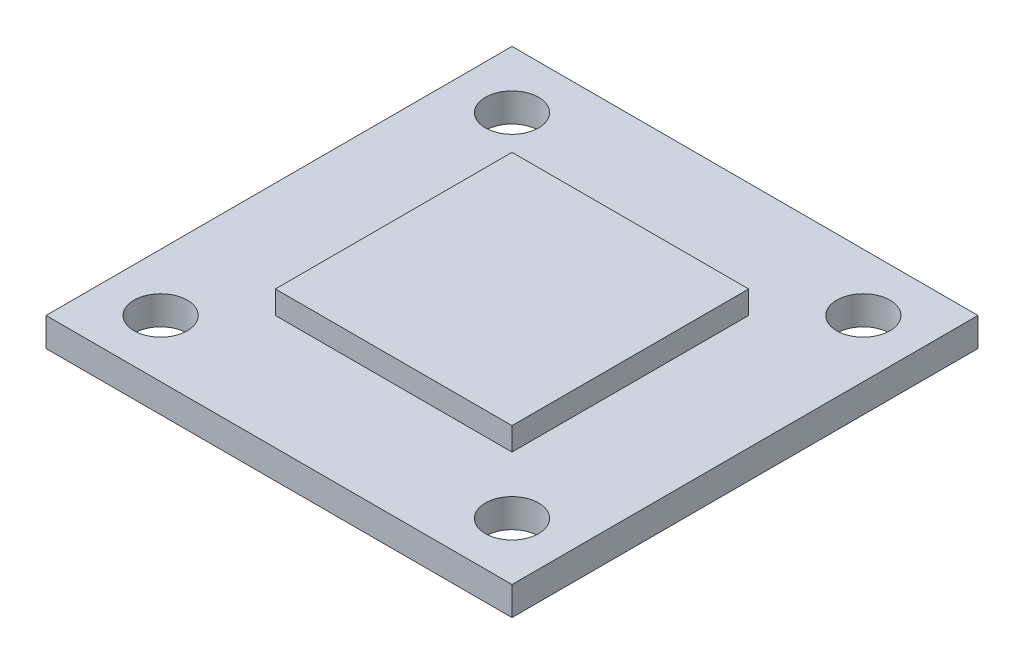
ISO-10303-21;
HEADER;
FILE_DESCRIPTION(('STEP AP214'),'2;1');
FILE_NAME('part.step','',(''),(''),'','','');
FILE_SCHEMA(('AUTOMOTIVE_DESIGN { 1 0 10303 214 1 1 1 1 }'));
ENDSEC;
DATA;
#1=APPLICATION_CONTEXT('core data for automotive mechanical design processes');
#2=APPLICATION_PROTOCOL_DEFINITION('international standard','automotive_design',2000,#1);
#3=PRODUCT_CONTEXT('',#1,'mechanical');
#4=PRODUCT('Part','Part','',(#3));
#5=PRODUCT_RELATED_PRODUCT_CATEGORY('part','',(#4));
#6=PRODUCT_DEFINITION_FORMATION('','',#4);
#7=PRODUCT_DEFINITION_CONTEXT('part definition',#1,'design');
#8=PRODUCT_DEFINITION('design','',#6,#7);
#9=PRODUCT_DEFINITION_SHAPE('','',#8);
#10=(LENGTH_UNIT() NAMED_UNIT(*) SI_UNIT(.MILLI.,.METRE.));
#11=(NAMED_UNIT(*) PLANE_ANGLE_UNIT() SI_UNIT($,.RADIAN.));
#12=(NAMED_UNIT(*) SI_UNIT($,.STERADIAN.) SOLID_ANGLE_UNIT());
#13=UNCERTAINTY_MEASURE_WITH_UNIT(LENGTH_MEASURE(1.E-05),#10,'distance_accuracy_value','');
#14=(GEOMETRIC_REPRESENTATION_CONTEXT(3) GLOBAL_UNCERTAINTY_ASSIGNED_CONTEXT((#13)) GLOBAL_UNIT_ASSIGNED_CONTEXT((#10,
#11,#12)) REPRESENTATION_CONTEXT('',''));
#15=CARTESIAN_POINT('',(0.,0.,0.));
#16=DIRECTION('',(0.,0.,1.));
#17=DIRECTION('',(1.,0.,0.));
#18=AXIS2_PLACEMENT_3D('',#15,#16,#17);
#19=CARTESIAN_POINT('',(0.,1.5875,0.));
#20=DIRECTION('',(0.,-1.,0.));
#21=DIRECTION('',(0.,0.,-1.));
#22=AXIS2_PLACEMENT_3D('',#19,#20,#21);
#23=PLANE('',#22);
#24=CARTESIAN_POINT('',(-9.7282,1.5875,-9.7282));
#25=DIRECTION('',(0.,1.,0.));
#26=DIRECTION('',(0.,0.,1.));
#27=AXIS2_PLACEMENT_3D('',#24,#25,#26);
#28=CIRCLE('',#27,1.4732);
#29=CARTESIAN_POINT('',(-9.7282,1.5875,-8.255));
#30=VERTEX_POINT('',#29);
#31=EDGE_CURVE('E229',#30,#30,#28,.T.);
#32=ORIENTED_EDGE('',*,*,#31,.F.);
#33=EDGE_LOOP('',(#32));
#34=FACE_BOUND('',#33,.T.);
#35=CARTESIAN_POINT('',(9.7282,1.5875,9.7282));
#36=DIRECTION('',(0.,1.,0.));
#37=DIRECTION('',(0.,0.,1.));
#38=AXIS2_PLACEMENT_3D('',#35,#36,#37);
#39=CIRCLE('',#38,1.4732);
#40=CARTESIAN_POINT('',(9.7282,1.5875,11.2014));
#41=VERTEX_POINT('',#40);
#42=EDGE_CURVE('E239',#41,#41,#39,.T.);
#43=ORIENTED_EDGE('',*,*,#42,.F.);
#44=EDGE_LOOP('',(#43));
#45=FACE_BOUND('',#44,.T.);
#46=CARTESIAN_POINT('',(9.7282,1.5875,-9.7282));
#47=DIRECTION('',(0.,1.,0.));
#48=DIRECTION('',(0.,0.,1.));
#49=AXIS2_PLACEMENT_3D('',#46,#47,#48);
#50=CIRCLE('',#49,1.4732);
#51=CARTESIAN_POINT('',(9.7282,1.5875,-8.255));
#52=VERTEX_POINT('',#51);
#53=EDGE_CURVE('E245',#52,#52,#50,.T.);
#54=ORIENTED_EDGE('',*,*,#53,.F.);
#55=EDGE_LOOP('',(#54));
#56=FACE_BOUND('',#55,.T.);
#57=DIRECTION('',(0.,0.,-1.));
#58=VECTOR('',#57,1.);
#59=CARTESIAN_POINT('',(12.9032,1.5875,12.9032));
#60=LINE('',#59,#58);
#61=CARTESIAN_POINT('',(12.9032,1.5875,12.9032));
#62=VERTEX_POINT('',#61);
#63=CARTESIAN_POINT('',(12.9032,1.5875,-12.9032));
#64=VERTEX_POINT('',#63);
#65=EDGE_CURVE('E127',#62,#64,#60,.T.);
#66=ORIENTED_EDGE('',*,*,#65,.T.);
#67=DIRECTION('',(-1.,0.,0.));
#68=VECTOR('',#67,1.);
#69=CARTESIAN_POINT('',(-12.9032,1.5875,-12.9032));
#70=LINE('',#69,#68);
#71=CARTESIAN_POINT('',(-12.9032,1.5875,-12.9032));
#72=VERTEX_POINT('',#71);
#73=EDGE_CURVE('E130',#64,#72,#70,.T.);
#74=ORIENTED_EDGE('',*,*,#73,.T.);
#75=DIRECTION('',(0.,0.,1.));
#76=VECTOR('',#75,1.);
#77=CARTESIAN_POINT('',(-12.9032,1.5875,12.9032));
#78=LINE('',#77,#76);
#79=CARTESIAN_POINT('',(-12.9032,1.5875,12.9032));
#80=VERTEX_POINT('',#79);
#81=EDGE_CURVE('E133',#72,#80,#78,.T.);
#82=ORIENTED_EDGE('',*,*,#81,.T.);
#83=DIRECTION('',(1.,0.,0.));
#84=VECTOR('',#83,1.);
#85=CARTESIAN_POINT('',(-12.9032,1.5875,12.9032));
#86=LINE('',#85,#84);
#87=EDGE_CURVE('E135',#80,#62,#86,.T.);
#88=ORIENTED_EDGE('',*,*,#87,.T.);
#89=EDGE_LOOP('',(#66,#74,#82,#88));
#90=FACE_BOUND('',#89,.T.);
#91=DIRECTION('',(0.,0.,-1.));
#92=VECTOR('',#91,1.);
#93=CARTESIAN_POINT('',(6.5532,1.5875,6.5532));
#94=LINE('',#93,#92);
#95=CARTESIAN_POINT('',(6.5532,1.5875,6.5532));
#96=VERTEX_POINT('',#95);
#97=CARTESIAN_POINT('',(6.5532,1.5875,-6.5532));
#98=VERTEX_POINT('',#97);
#99=EDGE_CURVE('E48',#96,#98,#94,.T.);
#100=ORIENTED_EDGE('',*,*,#99,.F.);
#101=DIRECTION('',(1.,0.,0.));
#102=VECTOR('',#101,1.);
#103=CARTESIAN_POINT('',(-6.5532,1.5875,6.5532));
#104=LINE('',#103,#102);
#105=CARTESIAN_POINT('',(-6.5532,1.5875,6.5532));
#106=VERTEX_POINT('',#105);
#107=EDGE_CURVE('E52',#106,#96,#104,.T.);
#108=ORIENTED_EDGE('',*,*,#107,.F.);
#109=DIRECTION('',(0.,0.,1.));
#110=VECTOR('',#109,1.);
#111=CARTESIAN_POINT('',(-6.5532,1.5875,6.5532));
#112=LINE('',#111,#110);
#113=CARTESIAN_POINT('',(-6.5532,1.5875,-6.5532));
#114=VERTEX_POINT('',#113);
#115=EDGE_CURVE('E257',#114,#106,#112,.T.);
#116=ORIENTED_EDGE('',*,*,#115,.F.);
#117=DIRECTION('',(-1.,0.,0.));
#118=VECTOR('',#117,1.);
#119=CARTESIAN_POINT('',(-6.5532,1.5875,-6.5532));
#120=LINE('',#119,#118);
#121=EDGE_CURVE('E255',#98,#114,#120,.T.);
#122=ORIENTED_EDGE('',*,*,#121,.F.);
#123=EDGE_LOOP('',(#100,#108,#116,#122));
#124=FACE_BOUND('',#123,.T.);
#125=CARTESIAN_POINT('',(-9.7282,1.5875,9.7282));
#126=DIRECTION('',(0.,1.,0.));
#127=DIRECTION('',(0.,0.,1.));
#128=AXIS2_PLACEMENT_3D('',#125,#126,#127);
#129=CIRCLE('',#128,1.4732);
#130=CARTESIAN_POINT('',(-9.7282,1.5875,11.2014));
#131=VERTEX_POINT('',#130);
#132=EDGE_CURVE('E231',#131,#131,#129,.T.);
#133=ORIENTED_EDGE('',*,*,#132,.F.);
#134=EDGE_LOOP('',(#133));
#135=FACE_BOUND('',#134,.T.);
#136=ADVANCED_FACE('F33',(#34,#45,#56,#90,#124,#135),#23,.F.);
#137=CARTESIAN_POINT('',(0.,0.,0.));
#138=DIRECTION('',(0.,-1.,0.));
#139=DIRECTION('',(0.,0.,-1.));
#140=AXIS2_PLACEMENT_3D('',#137,#138,#139);
#141=PLANE('',#140);
#142=CARTESIAN_POINT('',(-9.7282,0.,-9.7282));
#143=DIRECTION('',(0.,1.,0.));
#144=DIRECTION('',(0.,0.,1.));
#145=AXIS2_PLACEMENT_3D('',#142,#143,#144);
#146=CIRCLE('',#145,1.4732);
#147=CARTESIAN_POINT('',(-9.7282,0.,-8.255));
#148=VERTEX_POINT('',#147);
#149=EDGE_CURVE('E227',#148,#148,#146,.T.);
#150=ORIENTED_EDGE('',*,*,#149,.T.);
#151=EDGE_LOOP('',(#150));
#152=FACE_BOUND('',#151,.T.);
#153=DIRECTION('',(0.,0.,-1.));
#154=VECTOR('',#153,1.);
#155=CARTESIAN_POINT('',(12.9032,0.,12.9032));
#156=LINE('',#155,#154);
#157=CARTESIAN_POINT('',(12.9032,0.,12.9032));
#158=VERTEX_POINT('',#157);
#159=CARTESIAN_POINT('',(12.9032,0.,-12.9032));
#160=VERTEX_POINT('',#159);
#161=EDGE_CURVE('E118',#158,#160,#156,.T.);
#162=ORIENTED_EDGE('',*,*,#161,.F.);
#163=DIRECTION('',(1.,0.,0.));
#164=VECTOR('',#163,1.);
#165=CARTESIAN_POINT('',(-12.9032,0.,12.9032));
#166=LINE('',#165,#164);
#167=CARTESIAN_POINT('',(-12.9032,0.,12.9032));
#168=VERTEX_POINT('',#167);
#169=EDGE_CURVE('E131',#168,#158,#166,.T.);
#170=ORIENTED_EDGE('',*,*,#169,.F.);
#171=DIRECTION('',(0.,0.,1.));
#172=VECTOR('',#171,1.);
#173=CARTESIAN_POINT('',(-12.9032,0.,12.9032));
#174=LINE('',#173,#172);
#175=CARTESIAN_POINT('',(-12.9032,0.,-12.9032));
#176=VERTEX_POINT('',#175);
#177=EDGE_CURVE('E139',#176,#168,#174,.T.);
#178=ORIENTED_EDGE('',*,*,#177,.F.);
#179=DIRECTION('',(-1.,0.,0.));
#180=VECTOR('',#179,1.);
#181=CARTESIAN_POINT('',(-12.9032,0.,-12.9032));
#182=LINE('',#181,#180);
#183=EDGE_CURVE('E121',#160,#176,#182,.T.);
#184=ORIENTED_EDGE('',*,*,#183,.F.);
#185=EDGE_LOOP('',(#162,#170,#178,#184));
#186=FACE_BOUND('',#185,.T.);
#187=CARTESIAN_POINT('',(9.7282,0.,-9.7282));
#188=DIRECTION('',(0.,1.,0.));
#189=DIRECTION('',(0.,0.,1.));
#190=AXIS2_PLACEMENT_3D('',#187,#188,#189);
#191=CIRCLE('',#190,1.4732);
#192=CARTESIAN_POINT('',(9.7282,0.,-8.255));
#193=VERTEX_POINT('',#192);
#194=EDGE_CURVE('E248',#193,#193,#191,.T.);
#195=ORIENTED_EDGE('',*,*,#194,.T.);
#196=EDGE_LOOP('',(#195));
#197=FACE_BOUND('',#196,.T.);
#198=CARTESIAN_POINT('',(9.7282,0.,9.7282));
#199=DIRECTION('',(0.,1.,0.));
#200=DIRECTION('',(0.,0.,1.));
#201=AXIS2_PLACEMENT_3D('',#198,#199,#200);
#202=CIRCLE('',#201,1.4732);
#203=CARTESIAN_POINT('',(9.7282,0.,11.2014));
#204=VERTEX_POINT('',#203);
#205=EDGE_CURVE('E242',#204,#204,#202,.T.);
#206=ORIENTED_EDGE('',*,*,#205,.T.);
#207=EDGE_LOOP('',(#206));
#208=FACE_BOUND('',#207,.T.);
#209=CARTESIAN_POINT('',(-9.7282,0.,9.7282));
#210=DIRECTION('',(0.,1.,0.));
#211=DIRECTION('',(0.,0.,1.));
#212=AXIS2_PLACEMENT_3D('',#209,#210,#211);
#213=CIRCLE('',#212,1.4732);
#214=CARTESIAN_POINT('',(-9.7282,0.,11.2014));
#215=VERTEX_POINT('',#214);
#216=EDGE_CURVE('E236',#215,#215,#213,.T.);
#217=ORIENTED_EDGE('',*,*,#216,.T.);
#218=EDGE_LOOP('',(#217));
#219=FACE_BOUND('',#218,.T.);
#220=ADVANCED_FACE('F157',(#152,#186,#197,#208,#219),#141,.T.);
#221=CARTESIAN_POINT('',(12.9032,1.5875,12.9032));
#222=DIRECTION('',(-1.,0.,0.));
#223=DIRECTION('',(0.,0.,1.));
#224=AXIS2_PLACEMENT_3D('',#221,#222,#223);
#225=PLANE('',#224);
#226=ORIENTED_EDGE('',*,*,#161,.T.);
#227=DIRECTION('',(0.,-1.,0.));
#228=VECTOR('',#227,1.);
#229=CARTESIAN_POINT('',(12.9032,1.5875,-12.9032));
#230=LINE('',#229,#228);
#231=EDGE_CURVE('E11',#64,#160,#230,.T.);
#232=ORIENTED_EDGE('',*,*,#231,.F.);
#233=ORIENTED_EDGE('',*,*,#65,.F.);
#234=DIRECTION('',(0.,-1.,0.));
#235=VECTOR('',#234,1.);
#236=CARTESIAN_POINT('',(12.9032,1.5875,12.9032));
#237=LINE('',#236,#235);
#238=EDGE_CURVE('E136',#62,#158,#237,.T.);
#239=ORIENTED_EDGE('',*,*,#238,.T.);
#240=EDGE_LOOP('',(#226,#232,#233,#239));
#241=FACE_BOUND('',#240,.T.);
#242=ADVANCED_FACE('F35',(#241),#225,.F.);
#243=CARTESIAN_POINT('',(-12.9032,1.5875,-12.9032));
#244=DIRECTION('',(0.,0.,1.));
#245=DIRECTION('',(1.,0.,0.));
#246=AXIS2_PLACEMENT_3D('',#243,#244,#245);
#247=PLANE('',#246);
#248=ORIENTED_EDGE('',*,*,#183,.T.);
#249=DIRECTION('',(0.,-1.,0.));
#250=VECTOR('',#249,1.);
#251=CARTESIAN_POINT('',(-12.9032,1.5875,-12.9032));
#252=LINE('',#251,#250);
#253=EDGE_CURVE('E41',#72,#176,#252,.T.);
#254=ORIENTED_EDGE('',*,*,#253,.F.);
#255=ORIENTED_EDGE('',*,*,#73,.F.);
#256=ORIENTED_EDGE('',*,*,#231,.T.);
#257=EDGE_LOOP('',(#248,#254,#255,#256));
#258=FACE_BOUND('',#257,.T.);
#259=ADVANCED_FACE('F167',(#258),#247,.F.);
#260=CARTESIAN_POINT('',(-12.9032,1.5875,12.9032));
#261=DIRECTION('',(1.,0.,0.));
#262=DIRECTION('',(0.,0.,-1.));
#263=AXIS2_PLACEMENT_3D('',#260,#261,#262);
#264=PLANE('',#263);
#265=ORIENTED_EDGE('',*,*,#177,.T.);
#266=DIRECTION('',(0.,-1.,0.));
#267=VECTOR('',#266,1.);
#268=CARTESIAN_POINT('',(-12.9032,1.5875,12.9032));
#269=LINE('',#268,#267);
#270=EDGE_CURVE('E144',#80,#168,#269,.T.);
#271=ORIENTED_EDGE('',*,*,#270,.F.);
#272=ORIENTED_EDGE('',*,*,#81,.F.);
#273=ORIENTED_EDGE('',*,*,#253,.T.);
#274=EDGE_LOOP('',(#265,#271,#272,#273));
#275=FACE_BOUND('',#274,.T.);
#276=ADVANCED_FACE('F151',(#275),#264,.F.);
#277=CARTESIAN_POINT('',(-12.9032,1.5875,12.9032));
#278=DIRECTION('',(0.,0.,-1.));
#279=DIRECTION('',(-1.,0.,0.));
#280=AXIS2_PLACEMENT_3D('',#277,#278,#279);
#281=PLANE('',#280);
#282=ORIENTED_EDGE('',*,*,#169,.T.);
#283=ORIENTED_EDGE('',*,*,#238,.F.);
#284=ORIENTED_EDGE('',*,*,#87,.F.);
#285=ORIENTED_EDGE('',*,*,#270,.T.);
#286=EDGE_LOOP('',(#282,#283,#284,#285));
#287=FACE_BOUND('',#286,.T.);
#288=ADVANCED_FACE('F161',(#287),#281,.F.);
#289=CARTESIAN_POINT('',(6.5532,2.8575,6.5532));
#290=DIRECTION('',(-1.,0.,0.));
#291=DIRECTION('',(0.,0.,1.));
#292=AXIS2_PLACEMENT_3D('',#289,#290,#291);
#293=PLANE('',#292);
#294=ORIENTED_EDGE('',*,*,#99,.T.);
#295=DIRECTION('',(0.,-1.,0.));
#296=VECTOR('',#295,1.);
#297=CARTESIAN_POINT('',(6.5532,2.8575,-6.5532));
#298=LINE('',#297,#296);
#299=CARTESIAN_POINT('',(6.5532,2.8575,-6.5532));
#300=VERTEX_POINT('',#299);
#301=EDGE_CURVE('E101',#300,#98,#298,.T.);
#302=ORIENTED_EDGE('',*,*,#301,.F.);
#303=DIRECTION('',(0.,0.,-1.));
#304=VECTOR('',#303,1.);
#305=CARTESIAN_POINT('',(6.5532,2.8575,6.5532));
#306=LINE('',#305,#304);
#307=CARTESIAN_POINT('',(6.5532,2.8575,6.5532));
#308=VERTEX_POINT('',#307);
#309=EDGE_CURVE('E107',#308,#300,#306,.T.);
#310=ORIENTED_EDGE('',*,*,#309,.F.);
#311=DIRECTION('',(0.,-1.,0.));
#312=VECTOR('',#311,1.);
#313=CARTESIAN_POINT('',(6.5532,2.8575,6.5532));
#314=LINE('',#313,#312);
#315=EDGE_CURVE('E253',#308,#96,#314,.T.);
#316=ORIENTED_EDGE('',*,*,#315,.T.);
#317=EDGE_LOOP('',(#294,#302,#310,#316));
#318=FACE_BOUND('',#317,.T.);
#319=ADVANCED_FACE('F117',(#318),#293,.F.);
#320=CARTESIAN_POINT('',(-6.5532,2.8575,-6.5532));
#321=DIRECTION('',(0.,0.,1.));
#322=DIRECTION('',(1.,0.,0.));
#323=AXIS2_PLACEMENT_3D('',#320,#321,#322);
#324=PLANE('',#323);
#325=ORIENTED_EDGE('',*,*,#121,.T.);
#326=DIRECTION('',(0.,-1.,0.));
#327=VECTOR('',#326,1.);
#328=CARTESIAN_POINT('',(-6.5532,2.8575,-6.5532));
#329=LINE('',#328,#327);
#330=CARTESIAN_POINT('',(-6.5532,2.8575,-6.5532));
#331=VERTEX_POINT('',#330);
#332=EDGE_CURVE('E103',#331,#114,#329,.T.);
#333=ORIENTED_EDGE('',*,*,#332,.F.);
#334=DIRECTION('',(-1.,0.,0.));
#335=VECTOR('',#334,1.);
#336=CARTESIAN_POINT('',(-6.5532,2.8575,-6.5532));
#337=LINE('',#336,#335);
#338=EDGE_CURVE('E96',#300,#331,#337,.T.);
#339=ORIENTED_EDGE('',*,*,#338,.F.);
#340=ORIENTED_EDGE('',*,*,#301,.T.);
#341=EDGE_LOOP('',(#325,#333,#339,#340));
#342=FACE_BOUND('',#341,.T.);
#343=ADVANCED_FACE('F99',(#342),#324,.F.);
#344=CARTESIAN_POINT('',(-6.5532,2.8575,6.5532));
#345=DIRECTION('',(1.,0.,0.));
#346=DIRECTION('',(0.,0.,-1.));
#347=AXIS2_PLACEMENT_3D('',#344,#345,#346);
#348=PLANE('',#347);
#349=ORIENTED_EDGE('',*,*,#115,.T.);
#350=DIRECTION('',(0.,-1.,0.));
#351=VECTOR('',#350,1.);
#352=CARTESIAN_POINT('',(-6.5532,2.8575,6.5532));
#353=LINE('',#352,#351);
#354=CARTESIAN_POINT('',(-6.5532,2.8575,6.5532));
#355=VERTEX_POINT('',#354);
#356=EDGE_CURVE('E123',#355,#106,#353,.T.);
#357=ORIENTED_EDGE('',*,*,#356,.F.);
#358=DIRECTION('',(0.,0.,1.));
#359=VECTOR('',#358,1.);
#360=CARTESIAN_POINT('',(-6.5532,2.8575,6.5532));
#361=LINE('',#360,#359);
#362=EDGE_CURVE('E106',#331,#355,#361,.T.);
#363=ORIENTED_EDGE('',*,*,#362,.F.);
#364=ORIENTED_EDGE('',*,*,#332,.T.);
#365=EDGE_LOOP('',(#349,#357,#363,#364));
#366=FACE_BOUND('',#365,.T.);
#367=ADVANCED_FACE('F194',(#366),#348,.F.);
#368=CARTESIAN_POINT('',(-6.5532,2.8575,6.5532));
#369=DIRECTION('',(0.,0.,-1.));
#370=DIRECTION('',(-1.,0.,0.));
#371=AXIS2_PLACEMENT_3D('',#368,#369,#370);
#372=PLANE('',#371);
#373=ORIENTED_EDGE('',*,*,#107,.T.);
#374=ORIENTED_EDGE('',*,*,#315,.F.);
#375=DIRECTION('',(1.,0.,0.));
#376=VECTOR('',#375,1.);
#377=CARTESIAN_POINT('',(-6.5532,2.8575,6.5532));
#378=LINE('',#377,#376);
#379=EDGE_CURVE('E112',#355,#308,#378,.T.);
#380=ORIENTED_EDGE('',*,*,#379,.F.);
#381=ORIENTED_EDGE('',*,*,#356,.T.);
#382=EDGE_LOOP('',(#373,#374,#380,#381));
#383=FACE_BOUND('',#382,.T.);
#384=ADVANCED_FACE('F198',(#383),#372,.F.);
#385=CARTESIAN_POINT('',(0.,2.8575,0.));
#386=DIRECTION('',(0.,-1.,0.));
#387=DIRECTION('',(0.,0.,-1.));
#388=AXIS2_PLACEMENT_3D('',#385,#386,#387);
#389=PLANE('',#388);
#390=ORIENTED_EDGE('',*,*,#309,.T.);
#391=ORIENTED_EDGE('',*,*,#338,.T.);
#392=ORIENTED_EDGE('',*,*,#362,.T.);
#393=ORIENTED_EDGE('',*,*,#379,.T.);
#394=EDGE_LOOP('',(#390,#391,#392,#393));
#395=FACE_BOUND('',#394,.T.);
#396=ADVANCED_FACE('F110',(#395),#389,.F.);
#397=CARTESIAN_POINT('',(9.7282,1.5875,-9.7282));
#398=DIRECTION('',(0.,1.,0.));
#399=DIRECTION('',(0.,0.,1.));
#400=AXIS2_PLACEMENT_3D('',#397,#398,#399);
#401=CYLINDRICAL_SURFACE('',#400,1.4732);
#402=ORIENTED_EDGE('',*,*,#194,.F.);
#403=EDGE_LOOP('',(#402));
#404=FACE_BOUND('',#403,.T.);
#405=ORIENTED_EDGE('',*,*,#53,.T.);
#406=EDGE_LOOP('',(#405));
#407=FACE_BOUND('',#406,.T.);
#408=ADVANCED_FACE('F207',(#404,#407),#401,.F.);
#409=CARTESIAN_POINT('',(9.7282,1.5875,9.7282));
#410=DIRECTION('',(0.,1.,0.));
#411=DIRECTION('',(0.,0.,1.));
#412=AXIS2_PLACEMENT_3D('',#409,#410,#411);
#413=CYLINDRICAL_SURFACE('',#412,1.4732);
#414=ORIENTED_EDGE('',*,*,#205,.F.);
#415=EDGE_LOOP('',(#414));
#416=FACE_BOUND('',#415,.T.);
#417=ORIENTED_EDGE('',*,*,#42,.T.);
#418=EDGE_LOOP('',(#417));
#419=FACE_BOUND('',#418,.T.);
#420=ADVANCED_FACE('F210',(#416,#419),#413,.F.);
#421=CARTESIAN_POINT('',(-9.7282,1.5875,9.7282));
#422=DIRECTION('',(0.,1.,0.));
#423=DIRECTION('',(0.,0.,1.));
#424=AXIS2_PLACEMENT_3D('',#421,#422,#423);
#425=CYLINDRICAL_SURFACE('',#424,1.4732);
#426=ORIENTED_EDGE('',*,*,#216,.F.);
#427=EDGE_LOOP('',(#426));
#428=FACE_BOUND('',#427,.T.);
#429=ORIENTED_EDGE('',*,*,#132,.T.);
#430=EDGE_LOOP('',(#429));
#431=FACE_BOUND('',#430,.T.);
#432=ADVANCED_FACE('F214',(#428,#431),#425,.F.);
#433=CARTESIAN_POINT('',(-9.7282,1.5875,-9.7282));
#434=DIRECTION('',(0.,1.,0.));
#435=DIRECTION('',(0.,0.,1.));
#436=AXIS2_PLACEMENT_3D('',#433,#434,#435);
#437=CYLINDRICAL_SURFACE('',#436,1.4732);
#438=ORIENTED_EDGE('',*,*,#149,.F.);
#439=EDGE_LOOP('',(#438));
#440=FACE_BOUND('',#439,.T.);
#441=ORIENTED_EDGE('',*,*,#31,.T.);
#442=EDGE_LOOP('',(#441));
#443=FACE_BOUND('',#442,.T.);
#444=ADVANCED_FACE('F218',(#440,#443),#437,.F.);
#445=CLOSED_SHELL('',(#136,#220,#242,#259,#276,#288,#319,#343,#367,#384,#396,#408,#420,#432,#444));
#446=MANIFOLD_SOLID_BREP('B2',#445);
#447=ADVANCED_BREP_SHAPE_REPRESENTATION('',(#18,#446),#14);
#448=SHAPE_DEFINITION_REPRESENTATION(#9,#447);
ENDSEC;
END-ISO-10303-21;
